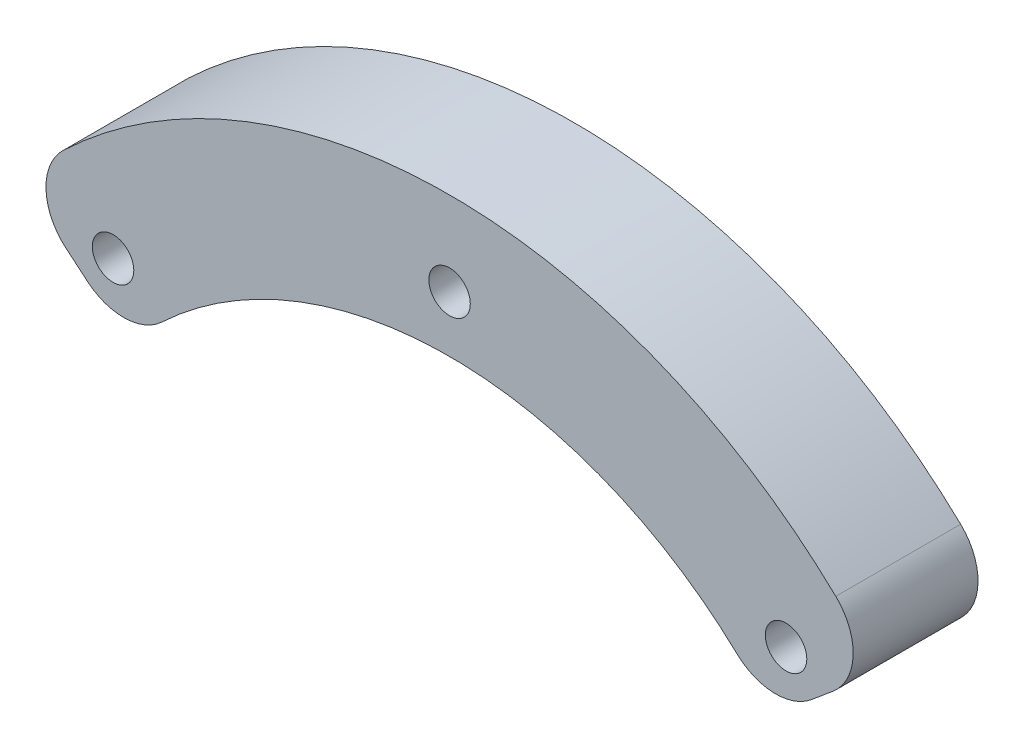
ISO-10303-21;
HEADER;
FILE_DESCRIPTION(('STEP AP214'),'2;1');
FILE_NAME('part.step','',(''),(''),'','','');
FILE_SCHEMA(('AUTOMOTIVE_DESIGN { 1 0 10303 214 1 1 1 1 }'));
ENDSEC;
DATA;
#1=APPLICATION_CONTEXT('core data for automotive mechanical design processes');
#2=APPLICATION_PROTOCOL_DEFINITION('international standard','automotive_design',2000,#1);
#3=PRODUCT_CONTEXT('',#1,'mechanical');
#4=PRODUCT('Part','Part','',(#3));
#5=PRODUCT_RELATED_PRODUCT_CATEGORY('part','',(#4));
#6=PRODUCT_DEFINITION_FORMATION('','',#4);
#7=PRODUCT_DEFINITION_CONTEXT('part definition',#1,'design');
#8=PRODUCT_DEFINITION('design','',#6,#7);
#9=PRODUCT_DEFINITION_SHAPE('','',#8);
#10=(LENGTH_UNIT() NAMED_UNIT(*) SI_UNIT(.MILLI.,.METRE.));
#11=(NAMED_UNIT(*) PLANE_ANGLE_UNIT() SI_UNIT($,.RADIAN.));
#12=(NAMED_UNIT(*) SI_UNIT($,.STERADIAN.) SOLID_ANGLE_UNIT());
#13=UNCERTAINTY_MEASURE_WITH_UNIT(LENGTH_MEASURE(1.E-05),#10,'distance_accuracy_value','');
#14=(GEOMETRIC_REPRESENTATION_CONTEXT(3) GLOBAL_UNCERTAINTY_ASSIGNED_CONTEXT((#13)) GLOBAL_UNIT_ASSIGNED_CONTEXT((#10,
#11,#12)) REPRESENTATION_CONTEXT('',''));
#15=CARTESIAN_POINT('',(0.,0.,0.));
#16=DIRECTION('',(0.,0.,1.));
#17=DIRECTION('',(1.,0.,0.));
#18=AXIS2_PLACEMENT_3D('',#15,#16,#17);
#19=CARTESIAN_POINT('',(0.,0.,-11.15));
#20=DIRECTION('',(-0.642787609686544,0.766044443118974,0.));
#21=DIRECTION('',(-0.766044443118974,-0.642787609686544,0.));
#22=AXIS2_PLACEMENT_3D('',#19,#20,#21);
#23=PLANE('',#22);
#24=DIRECTION('',(0.766044443118974,0.642787609686544,0.));
#25=VECTOR('',#24,1.);
#26=CARTESIAN_POINT('',(0.,0.,0.));
#27=LINE('',#26,#25);
#28=CARTESIAN_POINT('',(32.3307965914018,27.1287594955132,0.));
#29=VERTEX_POINT('',#28);
#30=CARTESIAN_POINT('',(34.258548972,28.7463358070743,0.));
#31=VERTEX_POINT('',#30);
#32=EDGE_CURVE('E116',#29,#31,#27,.T.);
#33=ORIENTED_EDGE('',*,*,#32,.F.);
#34=DIRECTION('',(0.,0.,-1.));
#35=VECTOR('',#34,1.);
#36=CARTESIAN_POINT('',(32.3307965914018,27.1287594955132,0.));
#37=LINE('',#36,#35);
#38=CARTESIAN_POINT('',(32.3307965914018,27.1287594955132,-11.15));
#39=VERTEX_POINT('',#38);
#40=EDGE_CURVE('E120',#39,#29,#37,.F.);
#41=ORIENTED_EDGE('',*,*,#40,.F.);
#42=DIRECTION('',(0.766044443118974,0.642787609686544,0.));
#43=VECTOR('',#42,1.);
#44=CARTESIAN_POINT('',(0.,0.,-11.15));
#45=LINE('',#44,#43);
#46=CARTESIAN_POINT('',(34.258548972,28.7463358070743,-11.15));
#47=VERTEX_POINT('',#46);
#48=EDGE_CURVE('E193',#39,#47,#45,.T.);
#49=ORIENTED_EDGE('',*,*,#48,.T.);
#50=DIRECTION('',(0.,0.,1.));
#51=VECTOR('',#50,1.);
#52=CARTESIAN_POINT('',(34.258548972,28.7463358070743,-11.15));
#53=LINE('',#52,#51);
#54=EDGE_CURVE('E161',#31,#47,#53,.F.);
#55=ORIENTED_EDGE('',*,*,#54,.F.);
#56=EDGE_LOOP('',(#33,#41,#49,#55));
#57=FACE_BOUND('',#56,.T.);
#58=ADVANCED_FACE('F43',(#57),#23,.F.);
#59=CARTESIAN_POINT('',(0.,0.,-11.15));
#60=DIRECTION('',(0.,0.,1.));
#61=DIRECTION('',(-1.,0.,0.));
#62=AXIS2_PLACEMENT_3D('',#59,#60,#61);
#63=CYLINDRICAL_SURFACE('',#62,50.);
#64=CARTESIAN_POINT('',(0.,0.,-11.15));
#65=DIRECTION('',(0.,0.,1.));
#66=DIRECTION('',(1.,0.,0.));
#67=AXIS2_PLACEMENT_3D('',#64,#65,#66);
#68=CIRCLE('',#67,50.);
#69=CARTESIAN_POINT('',(34.4940121372969,36.1961755807435,-11.15));
#70=VERTEX_POINT('',#69);
#71=CARTESIAN_POINT('',(-34.494012137297,36.1961755807435,-11.15));
#72=VERTEX_POINT('',#71);
#73=EDGE_CURVE('E194',#70,#72,#68,.T.);
#74=ORIENTED_EDGE('',*,*,#73,.T.);
#75=DIRECTION('',(0.,0.,1.));
#76=VECTOR('',#75,1.);
#77=CARTESIAN_POINT('',(-34.494012137297,36.1961755807435,-11.15));
#78=LINE('',#77,#76);
#79=CARTESIAN_POINT('',(-34.494012137297,36.1961755807435,0.));
#80=VERTEX_POINT('',#79);
#81=EDGE_CURVE('E131',#80,#72,#78,.F.);
#82=ORIENTED_EDGE('',*,*,#81,.F.);
#83=CARTESIAN_POINT('',(0.,0.,0.));
#84=DIRECTION('',(0.,0.,1.));
#85=DIRECTION('',(1.,0.,0.));
#86=AXIS2_PLACEMENT_3D('',#83,#84,#85);
#87=CIRCLE('',#86,50.);
#88=CARTESIAN_POINT('',(34.4940121372969,36.1961755807435,0.));
#89=VERTEX_POINT('',#88);
#90=EDGE_CURVE('E113',#89,#80,#87,.T.);
#91=ORIENTED_EDGE('',*,*,#90,.F.);
#92=DIRECTION('',(0.,0.,1.));
#93=VECTOR('',#92,1.);
#94=CARTESIAN_POINT('',(34.4940121372969,36.1961755807435,-11.15));
#95=LINE('',#94,#93);
#96=EDGE_CURVE('E124',#70,#89,#95,.T.);
#97=ORIENTED_EDGE('',*,*,#96,.F.);
#98=EDGE_LOOP('',(#74,#82,#91,#97));
#99=FACE_BOUND('',#98,.T.);
#100=ADVANCED_FACE('F133',(#99),#63,.T.);
#101=CARTESIAN_POINT('',(0.,0.,-11.15));
#102=DIRECTION('',(-0.642787609686543,-0.766044443118975,0.));
#103=DIRECTION('',(0.766044443118975,-0.642787609686543,0.));
#104=AXIS2_PLACEMENT_3D('',#101,#102,#103);
#105=PLANE('',#104);
#106=DIRECTION('',(-0.766044443118975,0.642787609686543,0.));
#107=VECTOR('',#106,1.);
#108=CARTESIAN_POINT('',(0.,0.,0.));
#109=LINE('',#108,#107);
#110=CARTESIAN_POINT('',(-32.3307965914018,27.1287594955132,0.));
#111=VERTEX_POINT('',#110);
#112=CARTESIAN_POINT('',(-34.258548972,28.7463358070743,0.));
#113=VERTEX_POINT('',#112);
#114=EDGE_CURVE('E135',#111,#113,#109,.T.);
#115=ORIENTED_EDGE('',*,*,#114,.T.);
#116=DIRECTION('',(0.,0.,-1.));
#117=VECTOR('',#116,1.);
#118=CARTESIAN_POINT('',(-34.258548972,28.7463358070743,0.));
#119=LINE('',#118,#117);
#120=CARTESIAN_POINT('',(-34.258548972,28.7463358070743,-11.15));
#121=VERTEX_POINT('',#120);
#122=EDGE_CURVE('E51',#121,#113,#119,.F.);
#123=ORIENTED_EDGE('',*,*,#122,.F.);
#124=DIRECTION('',(-0.766044443118975,0.642787609686543,0.));
#125=VECTOR('',#124,1.);
#126=CARTESIAN_POINT('',(0.,0.,-11.15));
#127=LINE('',#126,#125);
#128=CARTESIAN_POINT('',(-32.3307965914018,27.1287594955132,-11.15));
#129=VERTEX_POINT('',#128);
#130=EDGE_CURVE('E196',#129,#121,#127,.T.);
#131=ORIENTED_EDGE('',*,*,#130,.F.);
#132=DIRECTION('',(0.,0.,1.));
#133=VECTOR('',#132,1.);
#134=CARTESIAN_POINT('',(-32.3307965914018,27.1287594955132,-11.15));
#135=LINE('',#134,#133);
#136=EDGE_CURVE('E11',#111,#129,#135,.F.);
#137=ORIENTED_EDGE('',*,*,#136,.F.);
#138=EDGE_LOOP('',(#115,#123,#131,#137));
#139=FACE_BOUND('',#138,.T.);
#140=ADVANCED_FACE('F179',(#139),#105,.T.);
#141=CARTESIAN_POINT('',(-30.0520382004283,30.0520382004283,-11.15));
#142=DIRECTION('',(0.,0.,1.));
#143=DIRECTION('',(-1.,0.,0.));
#144=AXIS2_PLACEMENT_3D('',#141,#142,#143);
#145=CYLINDRICAL_SURFACE('',#144,1.85);
#146=CARTESIAN_POINT('',(-30.0520382004283,30.0520382004283,-11.15));
#147=DIRECTION('',(0.,0.,1.));
#148=DIRECTION('',(1.,0.,0.));
#149=AXIS2_PLACEMENT_3D('',#146,#147,#148);
#150=CIRCLE('',#149,1.85);
#151=CARTESIAN_POINT('',(-28.2020382004283,30.0520382004283,-11.15));
#152=VERTEX_POINT('',#151);
#153=EDGE_CURVE('E203',#152,#152,#150,.T.);
#154=ORIENTED_EDGE('',*,*,#153,.F.);
#155=EDGE_LOOP('',(#154));
#156=FACE_BOUND('',#155,.T.);
#157=CARTESIAN_POINT('',(-30.0520382004283,30.0520382004283,0.));
#158=DIRECTION('',(0.,0.,1.));
#159=DIRECTION('',(1.,0.,0.));
#160=AXIS2_PLACEMENT_3D('',#157,#158,#159);
#161=CIRCLE('',#160,1.85);
#162=CARTESIAN_POINT('',(-28.2020382004283,30.0520382004283,0.));
#163=VERTEX_POINT('',#162);
#164=EDGE_CURVE('E146',#163,#163,#161,.T.);
#165=ORIENTED_EDGE('',*,*,#164,.T.);
#166=EDGE_LOOP('',(#165));
#167=FACE_BOUND('',#166,.T.);
#168=ADVANCED_FACE('F299',(#156,#167),#145,.F.);
#169=CARTESIAN_POINT('',(0.,0.,-11.15));
#170=DIRECTION('',(0.,0.,1.));
#171=DIRECTION('',(-1.,0.,0.));
#172=AXIS2_PLACEMENT_3D('',#169,#170,#171);
#173=CYLINDRICAL_SURFACE('',#172,37.5);
#174=CARTESIAN_POINT('',(0.,0.,0.));
#175=DIRECTION('',(0.,0.,1.));
#176=DIRECTION('',(1.,0.,0.));
#177=AXIS2_PLACEMENT_3D('',#174,#175,#176);
#178=CIRCLE('',#177,37.5);
#179=CARTESIAN_POINT('',(25.691345773208,27.3167485686248,0.));
#180=VERTEX_POINT('',#179);
#181=CARTESIAN_POINT('',(-25.6913457732081,27.3167485686248,0.));
#182=VERTEX_POINT('',#181);
#183=EDGE_CURVE('E138',#180,#182,#178,.T.);
#184=ORIENTED_EDGE('',*,*,#183,.T.);
#185=DIRECTION('',(0.,0.,1.));
#186=VECTOR('',#185,1.);
#187=CARTESIAN_POINT('',(-25.6913457732081,27.3167485686248,-11.15));
#188=LINE('',#187,#186);
#189=CARTESIAN_POINT('',(-25.6913457732081,27.3167485686248,-11.15));
#190=VERTEX_POINT('',#189);
#191=EDGE_CURVE('E168',#190,#182,#188,.T.);
#192=ORIENTED_EDGE('',*,*,#191,.F.);
#193=CARTESIAN_POINT('',(0.,0.,-11.15));
#194=DIRECTION('',(0.,0.,1.));
#195=DIRECTION('',(1.,0.,0.));
#196=AXIS2_PLACEMENT_3D('',#193,#194,#195);
#197=CIRCLE('',#196,37.5);
#198=CARTESIAN_POINT('',(25.691345773208,27.3167485686248,-11.15));
#199=VERTEX_POINT('',#198);
#200=EDGE_CURVE('E187',#199,#190,#197,.T.);
#201=ORIENTED_EDGE('',*,*,#200,.F.);
#202=DIRECTION('',(0.,0.,1.));
#203=VECTOR('',#202,1.);
#204=CARTESIAN_POINT('',(25.691345773208,27.3167485686248,-11.15));
#205=LINE('',#204,#203);
#206=EDGE_CURVE('E170',#180,#199,#205,.F.);
#207=ORIENTED_EDGE('',*,*,#206,.F.);
#208=EDGE_LOOP('',(#184,#192,#201,#207));
#209=FACE_BOUND('',#208,.T.);
#210=ADVANCED_FACE('F186',(#209),#173,.F.);
#211=CARTESIAN_POINT('',(0.,42.5,-11.15));
#212=DIRECTION('',(0.,0.,1.));
#213=DIRECTION('',(-1.,0.,0.));
#214=AXIS2_PLACEMENT_3D('',#211,#212,#213);
#215=CYLINDRICAL_SURFACE('',#214,1.85);
#216=CARTESIAN_POINT('',(0.,42.5,-11.15));
#217=DIRECTION('',(0.,0.,1.));
#218=DIRECTION('',(1.,0.,0.));
#219=AXIS2_PLACEMENT_3D('',#216,#217,#218);
#220=CIRCLE('',#219,1.85);
#221=CARTESIAN_POINT('',(1.84999999999999,42.5,-11.15));
#222=VERTEX_POINT('',#221);
#223=EDGE_CURVE('E152',#222,#222,#220,.T.);
#224=ORIENTED_EDGE('',*,*,#223,.F.);
#225=EDGE_LOOP('',(#224));
#226=FACE_BOUND('',#225,.T.);
#227=CARTESIAN_POINT('',(0.,42.5,0.));
#228=DIRECTION('',(0.,0.,1.));
#229=DIRECTION('',(1.,0.,0.));
#230=AXIS2_PLACEMENT_3D('',#227,#228,#229);
#231=CIRCLE('',#230,1.85);
#232=CARTESIAN_POINT('',(1.84999999999999,42.5,0.));
#233=VERTEX_POINT('',#232);
#234=EDGE_CURVE('E140',#233,#233,#231,.T.);
#235=ORIENTED_EDGE('',*,*,#234,.T.);
#236=EDGE_LOOP('',(#235));
#237=FACE_BOUND('',#236,.T.);
#238=ADVANCED_FACE('F210',(#226,#237),#215,.F.);
#239=CARTESIAN_POINT('',(30.0520382004283,30.0520382004283,-11.15));
#240=DIRECTION('',(0.,0.,1.));
#241=DIRECTION('',(-1.,0.,0.));
#242=AXIS2_PLACEMENT_3D('',#239,#240,#241);
#243=CYLINDRICAL_SURFACE('',#242,1.85);
#244=CARTESIAN_POINT('',(30.0520382004283,30.0520382004283,-11.15));
#245=DIRECTION('',(0.,0.,1.));
#246=DIRECTION('',(1.,0.,0.));
#247=AXIS2_PLACEMENT_3D('',#244,#245,#246);
#248=CIRCLE('',#247,1.85);
#249=CARTESIAN_POINT('',(31.9020382004283,30.0520382004283,-11.15));
#250=VERTEX_POINT('',#249);
#251=EDGE_CURVE('E153',#250,#250,#248,.T.);
#252=ORIENTED_EDGE('',*,*,#251,.F.);
#253=EDGE_LOOP('',(#252));
#254=FACE_BOUND('',#253,.T.);
#255=CARTESIAN_POINT('',(30.0520382004283,30.0520382004283,0.));
#256=DIRECTION('',(0.,0.,1.));
#257=DIRECTION('',(1.,0.,0.));
#258=AXIS2_PLACEMENT_3D('',#255,#256,#257);
#259=CIRCLE('',#258,1.85);
#260=CARTESIAN_POINT('',(31.9020382004283,30.0520382004283,0.));
#261=VERTEX_POINT('',#260);
#262=EDGE_CURVE('E149',#261,#261,#259,.T.);
#263=ORIENTED_EDGE('',*,*,#262,.T.);
#264=EDGE_LOOP('',(#263));
#265=FACE_BOUND('',#264,.T.);
#266=ADVANCED_FACE('F220',(#254,#265),#243,.F.);
#267=CARTESIAN_POINT('',(0.,0.,-11.15));
#268=DIRECTION('',(0.,0.,-1.));
#269=DIRECTION('',(1.,0.,0.));
#270=AXIS2_PLACEMENT_3D('',#267,#268,#269);
#271=PLANE('',#270);
#272=ORIENTED_EDGE('',*,*,#223,.T.);
#273=EDGE_LOOP('',(#272));
#274=FACE_BOUND('',#273,.T.);
#275=ORIENTED_EDGE('',*,*,#48,.F.);
#276=CARTESIAN_POINT('',(29.1168585429691,30.9589817111081,-11.15));
#277=DIRECTION('',(0.,0.,1.));
#278=DIRECTION('',(1.,0.,0.));
#279=AXIS2_PLACEMENT_3D('',#276,#277,#278);
#280=CIRCLE('',#279,5.);
#281=EDGE_CURVE('E64',#199,#39,#280,.T.);
#282=ORIENTED_EDGE('',*,*,#281,.F.);
#283=ORIENTED_EDGE('',*,*,#200,.T.);
#284=CARTESIAN_POINT('',(-29.1168585429691,30.9589817111081,-11.15));
#285=DIRECTION('',(0.,0.,1.));
#286=DIRECTION('',(1.,0.,0.));
#287=AXIS2_PLACEMENT_3D('',#284,#285,#286);
#288=CIRCLE('',#287,5.);
#289=EDGE_CURVE('E57',#129,#190,#288,.T.);
#290=ORIENTED_EDGE('',*,*,#289,.F.);
#291=ORIENTED_EDGE('',*,*,#130,.T.);
#292=CARTESIAN_POINT('',(-31.0446109235673,32.5765580226691,-11.15));
#293=DIRECTION('',(0.,0.,1.));
#294=DIRECTION('',(1.,0.,0.));
#295=AXIS2_PLACEMENT_3D('',#292,#293,#294);
#296=CIRCLE('',#295,5.);
#297=EDGE_CURVE('E163',#72,#121,#296,.T.);
#298=ORIENTED_EDGE('',*,*,#297,.F.);
#299=ORIENTED_EDGE('',*,*,#73,.F.);
#300=CARTESIAN_POINT('',(31.0446109235672,32.5765580226692,-11.15));
#301=DIRECTION('',(0.,0.,1.));
#302=DIRECTION('',(1.,0.,0.));
#303=AXIS2_PLACEMENT_3D('',#300,#301,#302);
#304=CIRCLE('',#303,5.);
#305=EDGE_CURVE('E126',#47,#70,#304,.T.);
#306=ORIENTED_EDGE('',*,*,#305,.F.);
#307=EDGE_LOOP('',(#275,#282,#283,#290,#291,#298,#299,#306));
#308=FACE_BOUND('',#307,.T.);
#309=ORIENTED_EDGE('',*,*,#153,.T.);
#310=EDGE_LOOP('',(#309));
#311=FACE_BOUND('',#310,.T.);
#312=ORIENTED_EDGE('',*,*,#251,.T.);
#313=EDGE_LOOP('',(#312));
#314=FACE_BOUND('',#313,.T.);
#315=ADVANCED_FACE('F213',(#274,#308,#311,#314),#271,.T.);
#316=CARTESIAN_POINT('',(0.,0.,0.));
#317=DIRECTION('',(0.,0.,-1.));
#318=DIRECTION('',(1.,0.,0.));
#319=AXIS2_PLACEMENT_3D('',#316,#317,#318);
#320=PLANE('',#319);
#321=ORIENTED_EDGE('',*,*,#234,.F.);
#322=EDGE_LOOP('',(#321));
#323=FACE_BOUND('',#322,.T.);
#324=ORIENTED_EDGE('',*,*,#90,.T.);
#325=CARTESIAN_POINT('',(-31.0446109235673,32.5765580226691,0.));
#326=DIRECTION('',(0.,0.,1.));
#327=DIRECTION('',(1.,0.,0.));
#328=AXIS2_PLACEMENT_3D('',#325,#326,#327);
#329=CIRCLE('',#328,5.);
#330=EDGE_CURVE('E130',#113,#80,#329,.F.);
#331=ORIENTED_EDGE('',*,*,#330,.F.);
#332=ORIENTED_EDGE('',*,*,#114,.F.);
#333=CARTESIAN_POINT('',(-29.1168585429691,30.9589817111081,0.));
#334=DIRECTION('',(0.,0.,1.));
#335=DIRECTION('',(1.,0.,0.));
#336=AXIS2_PLACEMENT_3D('',#333,#334,#335);
#337=CIRCLE('',#336,5.);
#338=EDGE_CURVE('E156',#182,#111,#337,.F.);
#339=ORIENTED_EDGE('',*,*,#338,.F.);
#340=ORIENTED_EDGE('',*,*,#183,.F.);
#341=CARTESIAN_POINT('',(29.1168585429691,30.9589817111081,0.));
#342=DIRECTION('',(0.,0.,1.));
#343=DIRECTION('',(1.,0.,0.));
#344=AXIS2_PLACEMENT_3D('',#341,#342,#343);
#345=CIRCLE('',#344,5.);
#346=EDGE_CURVE('E121',#29,#180,#345,.F.);
#347=ORIENTED_EDGE('',*,*,#346,.F.);
#348=ORIENTED_EDGE('',*,*,#32,.T.);
#349=CARTESIAN_POINT('',(31.0446109235672,32.5765580226692,0.));
#350=DIRECTION('',(0.,0.,1.));
#351=DIRECTION('',(1.,0.,0.));
#352=AXIS2_PLACEMENT_3D('',#349,#350,#351);
#353=CIRCLE('',#352,5.);
#354=EDGE_CURVE('E108',#89,#31,#353,.F.);
#355=ORIENTED_EDGE('',*,*,#354,.F.);
#356=EDGE_LOOP('',(#324,#331,#332,#339,#340,#347,#348,#355));
#357=FACE_BOUND('',#356,.T.);
#358=ORIENTED_EDGE('',*,*,#164,.F.);
#359=EDGE_LOOP('',(#358));
#360=FACE_BOUND('',#359,.T.);
#361=ORIENTED_EDGE('',*,*,#262,.F.);
#362=EDGE_LOOP('',(#361));
#363=FACE_BOUND('',#362,.T.);
#364=ADVANCED_FACE('F110',(#323,#357,#360,#363),#320,.F.);
#365=CARTESIAN_POINT('',(31.0446109235672,32.5765580226692,-11.15));
#366=DIRECTION('',(0.,0.,1.));
#367=DIRECTION('',(-1.,0.,0.));
#368=AXIS2_PLACEMENT_3D('',#365,#366,#367);
#369=CYLINDRICAL_SURFACE('',#368,5.);
#370=ORIENTED_EDGE('',*,*,#305,.T.);
#371=ORIENTED_EDGE('',*,*,#96,.T.);
#372=ORIENTED_EDGE('',*,*,#354,.T.);
#373=ORIENTED_EDGE('',*,*,#54,.T.);
#374=EDGE_LOOP('',(#370,#371,#372,#373));
#375=FACE_BOUND('',#374,.T.);
#376=ADVANCED_FACE('F125',(#375),#369,.T.);
#377=CARTESIAN_POINT('',(29.1168585429691,30.9589817111081,-11.15));
#378=DIRECTION('',(0.,0.,1.));
#379=DIRECTION('',(-1.,0.,0.));
#380=AXIS2_PLACEMENT_3D('',#377,#378,#379);
#381=CYLINDRICAL_SURFACE('',#380,5.);
#382=ORIENTED_EDGE('',*,*,#281,.T.);
#383=ORIENTED_EDGE('',*,*,#40,.T.);
#384=ORIENTED_EDGE('',*,*,#346,.T.);
#385=ORIENTED_EDGE('',*,*,#206,.T.);
#386=EDGE_LOOP('',(#382,#383,#384,#385));
#387=FACE_BOUND('',#386,.T.);
#388=ADVANCED_FACE('F189',(#387),#381,.T.);
#389=CARTESIAN_POINT('',(-29.1168585429691,30.9589817111081,-11.15));
#390=DIRECTION('',(0.,0.,1.));
#391=DIRECTION('',(-1.,0.,0.));
#392=AXIS2_PLACEMENT_3D('',#389,#390,#391);
#393=CYLINDRICAL_SURFACE('',#392,5.);
#394=ORIENTED_EDGE('',*,*,#289,.T.);
#395=ORIENTED_EDGE('',*,*,#191,.T.);
#396=ORIENTED_EDGE('',*,*,#338,.T.);
#397=ORIENTED_EDGE('',*,*,#136,.T.);
#398=EDGE_LOOP('',(#394,#395,#396,#397));
#399=FACE_BOUND('',#398,.T.);
#400=ADVANCED_FACE('F182',(#399),#393,.T.);
#401=CARTESIAN_POINT('',(-31.0446109235673,32.5765580226691,-11.15));
#402=DIRECTION('',(0.,0.,1.));
#403=DIRECTION('',(-1.,0.,0.));
#404=AXIS2_PLACEMENT_3D('',#401,#402,#403);
#405=CYLINDRICAL_SURFACE('',#404,5.);
#406=ORIENTED_EDGE('',*,*,#297,.T.);
#407=ORIENTED_EDGE('',*,*,#122,.T.);
#408=ORIENTED_EDGE('',*,*,#330,.T.);
#409=ORIENTED_EDGE('',*,*,#81,.T.);
#410=EDGE_LOOP('',(#406,#407,#408,#409));
#411=FACE_BOUND('',#410,.T.);
#412=ADVANCED_FACE('F45',(#411),#405,.T.);
#413=CLOSED_SHELL('',(#58,#100,#140,#168,#210,#238,#266,#315,#364,#376,#388,#400,#412));
#414=MANIFOLD_SOLID_BREP('B2',#413);
#415=ADVANCED_BREP_SHAPE_REPRESENTATION('',(#18,#414),#14);
#416=SHAPE_DEFINITION_REPRESENTATION(#9,#415);
ENDSEC;
END-ISO-10303-21;
